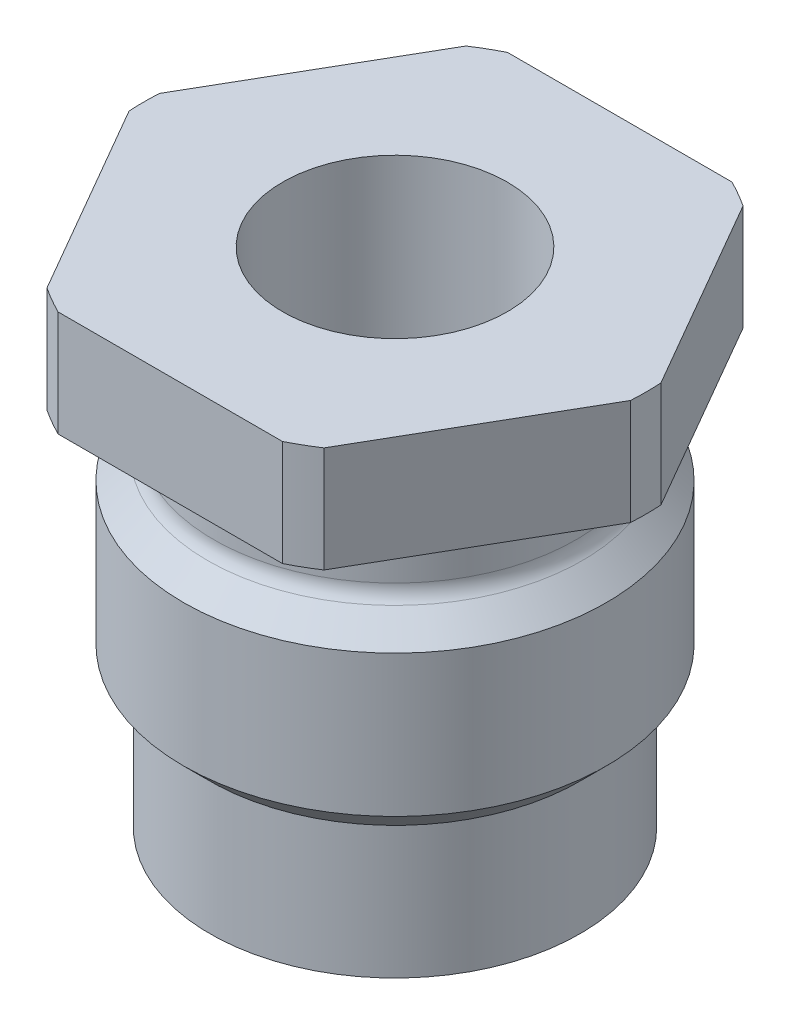
ISO-10303-21;
HEADER;
FILE_DESCRIPTION(('STEP AP214'),'2;1');
FILE_NAME('part.step','',(''),(''),'','','');
FILE_SCHEMA(('AUTOMOTIVE_DESIGN { 1 0 10303 214 1 1 1 1 }'));
ENDSEC;
DATA;
#1=APPLICATION_CONTEXT('core data for automotive mechanical design processes');
#2=APPLICATION_PROTOCOL_DEFINITION('international standard','automotive_design',2000,#1);
#3=PRODUCT_CONTEXT('',#1,'mechanical');
#4=PRODUCT('Part','Part','',(#3));
#5=PRODUCT_RELATED_PRODUCT_CATEGORY('part','',(#4));
#6=PRODUCT_DEFINITION_FORMATION('','',#4);
#7=PRODUCT_DEFINITION_CONTEXT('part definition',#1,'design');
#8=PRODUCT_DEFINITION('design','',#6,#7);
#9=PRODUCT_DEFINITION_SHAPE('','',#8);
#10=(LENGTH_UNIT() NAMED_UNIT(*) SI_UNIT(.MILLI.,.METRE.));
#11=(NAMED_UNIT(*) PLANE_ANGLE_UNIT() SI_UNIT($,.RADIAN.));
#12=(NAMED_UNIT(*) SI_UNIT($,.STERADIAN.) SOLID_ANGLE_UNIT());
#13=UNCERTAINTY_MEASURE_WITH_UNIT(LENGTH_MEASURE(1.E-05),#10,'distance_accuracy_value','');
#14=(GEOMETRIC_REPRESENTATION_CONTEXT(3) GLOBAL_UNCERTAINTY_ASSIGNED_CONTEXT((#13)) GLOBAL_UNIT_ASSIGNED_CONTEXT((#10,
#11,#12)) REPRESENTATION_CONTEXT('',''));
#15=CARTESIAN_POINT('',(0.,0.,0.));
#16=DIRECTION('',(0.,0.,1.));
#17=DIRECTION('',(1.,0.,0.));
#18=AXIS2_PLACEMENT_3D('',#15,#16,#17);
#19=CARTESIAN_POINT('',(-9.5,19.,0.));
#20=DIRECTION('',(0.,-1.,0.));
#21=DIRECTION('',(0.,0.,-1.));
#22=AXIS2_PLACEMENT_3D('',#19,#20,#21);
#23=PLANE('',#22);
#24=CARTESIAN_POINT('',(0.,19.,0.));
#25=DIRECTION('',(0.,-1.,0.));
#26=DIRECTION('',(0.,0.,-1.));
#27=AXIS2_PLACEMENT_3D('',#24,#25,#26);
#28=CIRCLE('',#27,4.25);
#29=CARTESIAN_POINT('',(0.,19.,-4.25));
#30=VERTEX_POINT('',#29);
#31=EDGE_CURVE('E153',#30,#30,#28,.T.);
#32=ORIENTED_EDGE('',*,*,#31,.T.);
#33=EDGE_LOOP('',(#32));
#34=FACE_BOUND('',#33,.T.);
#35=DIRECTION('',(0.5,0.,-0.866025403784439));
#36=VECTOR('',#35,1.);
#37=CARTESIAN_POINT('',(4.90747728811182,19.,8.5));
#38=LINE('',#37,#36);
#39=CARTESIAN_POINT('',(5.23989558860809,19.,7.92423461417476));
#40=VERTEX_POINT('',#39);
#41=CARTESIAN_POINT('',(9.48253627572737,19.,0.575765385825237));
#42=VERTEX_POINT('',#41);
#43=EDGE_CURVE('E136',#40,#42,#38,.T.);
#44=ORIENTED_EDGE('',*,*,#43,.T.);
#45=CARTESIAN_POINT('',(0.,19.,0.));
#46=DIRECTION('',(0.,-1.,0.));
#47=DIRECTION('',(0.,0.,-1.));
#48=AXIS2_PLACEMENT_3D('',#45,#46,#47);
#49=CIRCLE('',#48,9.5);
#50=CARTESIAN_POINT('',(9.48253627572737,19.,-0.575765385825233));
#51=VERTEX_POINT('',#50);
#52=EDGE_CURVE('E143',#51,#42,#49,.T.);
#53=ORIENTED_EDGE('',*,*,#52,.F.);
#54=DIRECTION('',(-0.5,0.,-0.866025403784438));
#55=VECTOR('',#54,1.);
#56=CARTESIAN_POINT('',(9.81495457622364,19.,0.));
#57=LINE('',#56,#55);
#58=CARTESIAN_POINT('',(5.23989558860808,19.,-7.92423461417477));
#59=VERTEX_POINT('',#58);
#60=EDGE_CURVE('E124',#51,#59,#57,.T.);
#61=ORIENTED_EDGE('',*,*,#60,.T.);
#62=CARTESIAN_POINT('',(4.24264068711928,19.,-8.5));
#63=VERTEX_POINT('',#62);
#64=EDGE_CURVE('E150',#63,#59,#49,.T.);
#65=ORIENTED_EDGE('',*,*,#64,.F.);
#66=DIRECTION('',(-1.,0.,0.));
#67=VECTOR('',#66,1.);
#68=CARTESIAN_POINT('',(4.90747728811181,19.,-8.5));
#69=LINE('',#68,#67);
#70=CARTESIAN_POINT('',(-4.24264068711928,19.,-8.5));
#71=VERTEX_POINT('',#70);
#72=EDGE_CURVE('E135',#63,#71,#69,.T.);
#73=ORIENTED_EDGE('',*,*,#72,.T.);
#74=CARTESIAN_POINT('',(-5.23989558860809,19.,-7.92423461417477));
#75=VERTEX_POINT('',#74);
#76=EDGE_CURVE('E154',#75,#71,#49,.T.);
#77=ORIENTED_EDGE('',*,*,#76,.F.);
#78=DIRECTION('',(-0.5,0.,0.866025403784439));
#79=VECTOR('',#78,1.);
#80=CARTESIAN_POINT('',(-4.90747728811182,19.,-8.5));
#81=LINE('',#80,#79);
#82=CARTESIAN_POINT('',(-9.48253627572737,19.,-0.575765385825234));
#83=VERTEX_POINT('',#82);
#84=EDGE_CURVE('E222',#75,#83,#81,.T.);
#85=ORIENTED_EDGE('',*,*,#84,.T.);
#86=CARTESIAN_POINT('',(-9.48253627572737,19.,0.575765385825239));
#87=VERTEX_POINT('',#86);
#88=EDGE_CURVE('E204',#87,#83,#49,.T.);
#89=ORIENTED_EDGE('',*,*,#88,.F.);
#90=DIRECTION('',(0.5,0.,0.866025403784438));
#91=VECTOR('',#90,1.);
#92=CARTESIAN_POINT('',(-9.81495457622364,19.,0.));
#93=LINE('',#92,#91);
#94=CARTESIAN_POINT('',(-5.23989558860809,19.,7.92423461417476));
#95=VERTEX_POINT('',#94);
#96=EDGE_CURVE('E220',#87,#95,#93,.T.);
#97=ORIENTED_EDGE('',*,*,#96,.T.);
#98=CARTESIAN_POINT('',(-4.24264068711929,19.,8.5));
#99=VERTEX_POINT('',#98);
#100=EDGE_CURVE('E156',#99,#95,#49,.T.);
#101=ORIENTED_EDGE('',*,*,#100,.F.);
#102=DIRECTION('',(1.,0.,0.));
#103=VECTOR('',#102,1.);
#104=CARTESIAN_POINT('',(-4.90747728811182,19.,8.5));
#105=LINE('',#104,#103);
#106=CARTESIAN_POINT('',(4.24264068711929,19.,8.5));
#107=VERTEX_POINT('',#106);
#108=EDGE_CURVE('E219',#99,#107,#105,.T.);
#109=ORIENTED_EDGE('',*,*,#108,.T.);
#110=EDGE_CURVE('E151',#40,#107,#49,.T.);
#111=ORIENTED_EDGE('',*,*,#110,.F.);
#112=EDGE_LOOP('',(#44,#53,#61,#65,#73,#77,#85,#89,#97,#101,#109,#111));
#113=FACE_BOUND('',#112,.T.);
#114=ADVANCED_FACE('F37',(#34,#113),#23,.F.);
#115=CARTESIAN_POINT('',(0.,0.,0.));
#116=DIRECTION('',(0.,-1.,0.));
#117=DIRECTION('',(0.,0.,-1.));
#118=AXIS2_PLACEMENT_3D('',#115,#116,#117);
#119=CYLINDRICAL_SURFACE('',#118,9.5);
#120=DIRECTION('',(0.,-1.,0.));
#121=VECTOR('',#120,1.);
#122=CARTESIAN_POINT('',(5.23989558860809,0.,7.92423461417476));
#123=LINE('',#122,#121);
#124=CARTESIAN_POINT('',(5.23989558860809,15.,7.92423461417477));
#125=VERTEX_POINT('',#124);
#126=EDGE_CURVE('E240',#40,#125,#123,.T.);
#127=ORIENTED_EDGE('',*,*,#126,.F.);
#128=ORIENTED_EDGE('',*,*,#110,.T.);
#129=DIRECTION('',(0.,-1.,0.));
#130=VECTOR('',#129,1.);
#131=CARTESIAN_POINT('',(4.24264068711929,0.,8.5));
#132=LINE('',#131,#130);
#133=CARTESIAN_POINT('',(4.24264068711928,15.,8.5));
#134=VERTEX_POINT('',#133);
#135=EDGE_CURVE('E174',#134,#107,#132,.F.);
#136=ORIENTED_EDGE('',*,*,#135,.F.);
#137=CARTESIAN_POINT('',(0.,15.,0.));
#138=DIRECTION('',(0.,-1.,0.));
#139=DIRECTION('',(0.,0.,-1.));
#140=AXIS2_PLACEMENT_3D('',#137,#138,#139);
#141=CIRCLE('',#140,9.5);
#142=EDGE_CURVE('E186',#125,#134,#141,.T.);
#143=ORIENTED_EDGE('',*,*,#142,.F.);
#144=EDGE_LOOP('',(#127,#128,#136,#143));
#145=FACE_BOUND('',#144,.T.);
#146=ADVANCED_FACE('F185',(#145),#119,.T.);
#147=DIRECTION('',(0.,-1.,0.));
#148=VECTOR('',#147,1.);
#149=CARTESIAN_POINT('',(9.48253627572737,0.,0.575765385825237));
#150=LINE('',#149,#148);
#151=CARTESIAN_POINT('',(9.48253627572737,15.,0.575765385825233));
#152=VERTEX_POINT('',#151);
#153=EDGE_CURVE('E238',#152,#42,#150,.F.);
#154=ORIENTED_EDGE('',*,*,#153,.F.);
#155=CARTESIAN_POINT('',(9.48253627572737,15.,-0.575765385825238));
#156=VERTEX_POINT('',#155);
#157=EDGE_CURVE('E145',#156,#152,#141,.T.);
#158=ORIENTED_EDGE('',*,*,#157,.F.);
#159=DIRECTION('',(0.,-1.,0.));
#160=VECTOR('',#159,1.);
#161=CARTESIAN_POINT('',(9.48253627572737,0.,-0.575765385825234));
#162=LINE('',#161,#160);
#163=EDGE_CURVE('E127',#51,#156,#162,.T.);
#164=ORIENTED_EDGE('',*,*,#163,.F.);
#165=ORIENTED_EDGE('',*,*,#52,.T.);
#166=EDGE_LOOP('',(#154,#158,#164,#165));
#167=FACE_BOUND('',#166,.T.);
#168=ADVANCED_FACE('F142',(#167),#119,.T.);
#169=DIRECTION('',(0.,-1.,0.));
#170=VECTOR('',#169,1.);
#171=CARTESIAN_POINT('',(-4.24264068711929,0.,8.5));
#172=LINE('',#171,#170);
#173=CARTESIAN_POINT('',(-4.24264068711929,15.,8.5));
#174=VERTEX_POINT('',#173);
#175=EDGE_CURVE('E177',#99,#174,#172,.T.);
#176=ORIENTED_EDGE('',*,*,#175,.F.);
#177=ORIENTED_EDGE('',*,*,#100,.T.);
#178=DIRECTION('',(0.,-1.,0.));
#179=VECTOR('',#178,1.);
#180=CARTESIAN_POINT('',(-5.23989558860809,0.,7.92423461417477));
#181=LINE('',#180,#179);
#182=CARTESIAN_POINT('',(-5.23989558860809,15.,7.92423461417477));
#183=VERTEX_POINT('',#182);
#184=EDGE_CURVE('E217',#183,#95,#181,.F.);
#185=ORIENTED_EDGE('',*,*,#184,.F.);
#186=EDGE_CURVE('E190',#174,#183,#141,.T.);
#187=ORIENTED_EDGE('',*,*,#186,.F.);
#188=EDGE_LOOP('',(#176,#177,#185,#187));
#189=FACE_BOUND('',#188,.T.);
#190=ADVANCED_FACE('F216',(#189),#119,.T.);
#191=DIRECTION('',(0.,-1.,0.));
#192=VECTOR('',#191,1.);
#193=CARTESIAN_POINT('',(-9.48253627572737,0.,0.57576538582524));
#194=LINE('',#193,#192);
#195=CARTESIAN_POINT('',(-9.48253627572737,15.,0.57576538582524));
#196=VERTEX_POINT('',#195);
#197=EDGE_CURVE('E60',#87,#196,#194,.T.);
#198=ORIENTED_EDGE('',*,*,#197,.F.);
#199=ORIENTED_EDGE('',*,*,#88,.T.);
#200=DIRECTION('',(0.,-1.,0.));
#201=VECTOR('',#200,1.);
#202=CARTESIAN_POINT('',(-9.48253627572737,0.,-0.575765385825233));
#203=LINE('',#202,#201);
#204=CARTESIAN_POINT('',(-9.48253627572737,15.,-0.575765385825233));
#205=VERTEX_POINT('',#204);
#206=EDGE_CURVE('E232',#205,#83,#203,.F.);
#207=ORIENTED_EDGE('',*,*,#206,.F.);
#208=EDGE_CURVE('E191',#196,#205,#141,.T.);
#209=ORIENTED_EDGE('',*,*,#208,.F.);
#210=EDGE_LOOP('',(#198,#199,#207,#209));
#211=FACE_BOUND('',#210,.T.);
#212=ADVANCED_FACE('F407',(#211),#119,.T.);
#213=DIRECTION('',(0.,-1.,0.));
#214=VECTOR('',#213,1.);
#215=CARTESIAN_POINT('',(-5.23989558860809,0.,-7.92423461417477));
#216=LINE('',#215,#214);
#217=CARTESIAN_POINT('',(-5.23989558860809,15.,-7.92423461417477));
#218=VERTEX_POINT('',#217);
#219=EDGE_CURVE('E52',#75,#218,#216,.T.);
#220=ORIENTED_EDGE('',*,*,#219,.F.);
#221=ORIENTED_EDGE('',*,*,#76,.T.);
#222=DIRECTION('',(0.,-1.,0.));
#223=VECTOR('',#222,1.);
#224=CARTESIAN_POINT('',(-4.24264068711928,0.,-8.5));
#225=LINE('',#224,#223);
#226=CARTESIAN_POINT('',(-4.24264068711928,15.,-8.5));
#227=VERTEX_POINT('',#226);
#228=EDGE_CURVE('E146',#227,#71,#225,.F.);
#229=ORIENTED_EDGE('',*,*,#228,.F.);
#230=EDGE_CURVE('E193',#218,#227,#141,.T.);
#231=ORIENTED_EDGE('',*,*,#230,.F.);
#232=EDGE_LOOP('',(#220,#221,#229,#231));
#233=FACE_BOUND('',#232,.T.);
#234=ADVANCED_FACE('F282',(#233),#119,.T.);
#235=DIRECTION('',(0.,-1.,0.));
#236=VECTOR('',#235,1.);
#237=CARTESIAN_POINT('',(4.24264068711928,0.,-8.5));
#238=LINE('',#237,#236);
#239=CARTESIAN_POINT('',(4.24264068711928,15.,-8.5));
#240=VERTEX_POINT('',#239);
#241=EDGE_CURVE('E230',#63,#240,#238,.T.);
#242=ORIENTED_EDGE('',*,*,#241,.F.);
#243=ORIENTED_EDGE('',*,*,#64,.T.);
#244=DIRECTION('',(0.,-1.,0.));
#245=VECTOR('',#244,1.);
#246=CARTESIAN_POINT('',(5.23989558860808,0.,-7.92423461417477));
#247=LINE('',#246,#245);
#248=CARTESIAN_POINT('',(5.23989558860808,15.,-7.92423461417477));
#249=VERTEX_POINT('',#248);
#250=EDGE_CURVE('E130',#249,#59,#247,.F.);
#251=ORIENTED_EDGE('',*,*,#250,.F.);
#252=EDGE_CURVE('E159',#240,#249,#141,.T.);
#253=ORIENTED_EDGE('',*,*,#252,.F.);
#254=EDGE_LOOP('',(#242,#243,#251,#253));
#255=FACE_BOUND('',#254,.T.);
#256=ADVANCED_FACE('F275',(#255),#119,.T.);
#257=CARTESIAN_POINT('',(-7.65000000000001,15.,0.));
#258=DIRECTION('',(0.,1.,0.));
#259=DIRECTION('',(0.,0.,1.));
#260=AXIS2_PLACEMENT_3D('',#257,#258,#259);
#261=PLANE('',#260);
#262=CARTESIAN_POINT('',(0.,15.,0.));
#263=DIRECTION('',(0.,-1.,0.));
#264=DIRECTION('',(0.,0.,-1.));
#265=AXIS2_PLACEMENT_3D('',#262,#263,#264);
#266=CIRCLE('',#265,7.65000000000001);
#267=CARTESIAN_POINT('',(0.,15.,-7.65000000000001));
#268=VERTEX_POINT('',#267);
#269=EDGE_CURVE('E196',#268,#268,#266,.T.);
#270=ORIENTED_EDGE('',*,*,#269,.F.);
#271=EDGE_LOOP('',(#270));
#272=FACE_BOUND('',#271,.T.);
#273=DIRECTION('',(0.5,0.,-0.866025403784439));
#274=VECTOR('',#273,1.);
#275=CARTESIAN_POINT('',(5.44871593216773,15.,7.56254716947548));
#276=LINE('',#275,#274);
#277=EDGE_CURVE('E12',#125,#152,#276,.T.);
#278=ORIENTED_EDGE('',*,*,#277,.F.);
#279=ORIENTED_EDGE('',*,*,#142,.T.);
#280=DIRECTION('',(1.,0.,0.));
#281=VECTOR('',#280,1.);
#282=CARTESIAN_POINT('',(-7.65000000000001,15.,8.5));
#283=LINE('',#282,#281);
#284=EDGE_CURVE('E45',#174,#134,#283,.T.);
#285=ORIENTED_EDGE('',*,*,#284,.F.);
#286=ORIENTED_EDGE('',*,*,#186,.T.);
#287=DIRECTION('',(0.5,0.,0.866025403784439));
#288=VECTOR('',#287,1.);
#289=CARTESIAN_POINT('',(-9.27371593216773,15.,0.937452830524521));
#290=LINE('',#289,#288);
#291=EDGE_CURVE('E169',#196,#183,#290,.T.);
#292=ORIENTED_EDGE('',*,*,#291,.F.);
#293=ORIENTED_EDGE('',*,*,#208,.T.);
#294=DIRECTION('',(-0.5,0.,0.866025403784439));
#295=VECTOR('',#294,1.);
#296=CARTESIAN_POINT('',(-9.27371593216773,15.,-0.937452830524519));
#297=LINE('',#296,#295);
#298=EDGE_CURVE('E167',#218,#205,#297,.T.);
#299=ORIENTED_EDGE('',*,*,#298,.F.);
#300=ORIENTED_EDGE('',*,*,#230,.T.);
#301=DIRECTION('',(-1.,0.,0.));
#302=VECTOR('',#301,1.);
#303=CARTESIAN_POINT('',(-7.65000000000001,15.,-8.5));
#304=LINE('',#303,#302);
#305=EDGE_CURVE('E165',#240,#227,#304,.T.);
#306=ORIENTED_EDGE('',*,*,#305,.F.);
#307=ORIENTED_EDGE('',*,*,#252,.T.);
#308=DIRECTION('',(-0.5,0.,-0.866025403784438));
#309=VECTOR('',#308,1.);
#310=CARTESIAN_POINT('',(5.44871593216772,15.,-7.56254716947549));
#311=LINE('',#310,#309);
#312=EDGE_CURVE('E163',#156,#249,#311,.T.);
#313=ORIENTED_EDGE('',*,*,#312,.F.);
#314=ORIENTED_EDGE('',*,*,#157,.T.);
#315=EDGE_LOOP('',(#278,#279,#285,#286,#292,#293,#299,#300,#306,#307,#313,#314));
#316=FACE_BOUND('',#315,.T.);
#317=ADVANCED_FACE('F189',(#272,#316),#261,.F.);
#318=CARTESIAN_POINT('',(0.,0.,0.));
#319=DIRECTION('',(0.,-1.,0.));
#320=DIRECTION('',(0.,0.,-1.));
#321=AXIS2_PLACEMENT_3D('',#318,#319,#320);
#322=CYLINDRICAL_SURFACE('',#321,4.25);
#323=ORIENTED_EDGE('',*,*,#31,.F.);
#324=EDGE_LOOP('',(#323));
#325=FACE_BOUND('',#324,.T.);
#326=CARTESIAN_POINT('',(0.,0.,0.));
#327=DIRECTION('',(0.,-1.,0.));
#328=DIRECTION('',(0.,0.,-1.));
#329=AXIS2_PLACEMENT_3D('',#326,#327,#328);
#330=CIRCLE('',#329,4.24999999999999);
#331=CARTESIAN_POINT('',(0.,0.,-4.24999999999999));
#332=VERTEX_POINT('',#331);
#333=EDGE_CURVE('E242',#332,#332,#330,.T.);
#334=ORIENTED_EDGE('',*,*,#333,.T.);
#335=EDGE_LOOP('',(#334));
#336=FACE_BOUND('',#335,.T.);
#337=ADVANCED_FACE('F39',(#325,#336),#322,.F.);
#338=CARTESIAN_POINT('',(0.,14.2,0.));
#339=DIRECTION('',(0.,-1.,0.));
#340=DIRECTION('',(0.,0.,-1.));
#341=AXIS2_PLACEMENT_3D('',#338,#339,#340);
#342=TOROIDAL_SURFACE('',#341,7.65,0.799999999999999);
#343=CARTESIAN_POINT('',(0.,14.2,0.));
#344=DIRECTION('',(0.,-1.,0.));
#345=DIRECTION('',(0.,0.,-1.));
#346=AXIS2_PLACEMENT_3D('',#343,#344,#345);
#347=CIRCLE('',#346,6.85);
#348=CARTESIAN_POINT('',(0.,14.2,-6.85));
#349=VERTEX_POINT('',#348);
#350=EDGE_CURVE('E200',#349,#349,#347,.T.);
#351=ORIENTED_EDGE('',*,*,#350,.F.);
#352=EDGE_LOOP('',(#351));
#353=FACE_BOUND('',#352,.T.);
#354=ORIENTED_EDGE('',*,*,#269,.T.);
#355=EDGE_LOOP('',(#354));
#356=FACE_BOUND('',#355,.T.);
#357=ADVANCED_FACE('F268',(#353,#356),#342,.F.);
#358=CARTESIAN_POINT('',(0.,0.,0.));
#359=DIRECTION('',(0.,-1.,0.));
#360=DIRECTION('',(0.,0.,-1.));
#361=AXIS2_PLACEMENT_3D('',#358,#359,#360);
#362=CYLINDRICAL_SURFACE('',#361,6.85);
#363=CARTESIAN_POINT('',(0.,12.8313708498985,0.));
#364=DIRECTION('',(0.,-1.,0.));
#365=DIRECTION('',(0.,0.,-1.));
#366=AXIS2_PLACEMENT_3D('',#363,#364,#365);
#367=CIRCLE('',#366,6.85);
#368=CARTESIAN_POINT('',(0.,12.8313708498985,-6.85));
#369=VERTEX_POINT('',#368);
#370=EDGE_CURVE('E260',#369,#369,#367,.T.);
#371=ORIENTED_EDGE('',*,*,#370,.F.);
#372=EDGE_LOOP('',(#371));
#373=FACE_BOUND('',#372,.T.);
#374=ORIENTED_EDGE('',*,*,#350,.T.);
#375=EDGE_LOOP('',(#374));
#376=FACE_BOUND('',#375,.T.);
#377=ADVANCED_FACE('F266',(#373,#376),#362,.T.);
#378=CARTESIAN_POINT('',(0.,12.8313708498985,0.));
#379=DIRECTION('',(0.,-1.,0.));
#380=DIRECTION('',(0.,0.,-1.));
#381=AXIS2_PLACEMENT_3D('',#378,#379,#380);
#382=TOROIDAL_SURFACE('',#381,7.65,0.799999999999999);
#383=CARTESIAN_POINT('',(0.,12.2656854249492,0.));
#384=DIRECTION('',(0.,-1.,0.));
#385=DIRECTION('',(0.,0.,-1.));
#386=AXIS2_PLACEMENT_3D('',#383,#384,#385);
#387=CIRCLE('',#386,7.08431457505076);
#388=CARTESIAN_POINT('',(0.,12.2656854249492,-7.08431457505076));
#389=VERTEX_POINT('',#388);
#390=EDGE_CURVE('E257',#389,#389,#387,.T.);
#391=ORIENTED_EDGE('',*,*,#390,.F.);
#392=EDGE_LOOP('',(#391));
#393=FACE_BOUND('',#392,.T.);
#394=ORIENTED_EDGE('',*,*,#370,.T.);
#395=EDGE_LOOP('',(#394));
#396=FACE_BOUND('',#395,.T.);
#397=ADVANCED_FACE('F321',(#393,#396),#382,.F.);
#398=CARTESIAN_POINT('',(0.,12.2656854249492,0.));
#399=DIRECTION('',(0.,-1.,0.));
#400=DIRECTION('',(0.,0.,-1.));
#401=AXIS2_PLACEMENT_3D('',#398,#399,#400);
#402=CONICAL_SURFACE('',#401,7.08431457505076,0.785398163397446);
#403=CARTESIAN_POINT('',(0.,11.35,0.));
#404=DIRECTION('',(0.,-1.,0.));
#405=DIRECTION('',(0.,0.,-1.));
#406=AXIS2_PLACEMENT_3D('',#403,#404,#405);
#407=CIRCLE('',#406,8.);
#408=CARTESIAN_POINT('',(0.,11.35,-8.));
#409=VERTEX_POINT('',#408);
#410=EDGE_CURVE('E254',#409,#409,#407,.T.);
#411=ORIENTED_EDGE('',*,*,#410,.F.);
#412=EDGE_LOOP('',(#411));
#413=FACE_BOUND('',#412,.T.);
#414=ORIENTED_EDGE('',*,*,#390,.T.);
#415=EDGE_LOOP('',(#414));
#416=FACE_BOUND('',#415,.T.);
#417=ADVANCED_FACE('F315',(#413,#416),#402,.T.);
#418=CARTESIAN_POINT('',(0.,0.,0.));
#419=DIRECTION('',(0.,-1.,0.));
#420=DIRECTION('',(0.,0.,-1.));
#421=AXIS2_PLACEMENT_3D('',#418,#419,#420);
#422=CYLINDRICAL_SURFACE('',#421,8.);
#423=CARTESIAN_POINT('',(0.,6.,0.));
#424=DIRECTION('',(0.,-1.,0.));
#425=DIRECTION('',(0.,0.,-1.));
#426=AXIS2_PLACEMENT_3D('',#423,#424,#425);
#427=CIRCLE('',#426,8.);
#428=CARTESIAN_POINT('',(0.,6.,-8.));
#429=VERTEX_POINT('',#428);
#430=EDGE_CURVE('E251',#429,#429,#427,.T.);
#431=ORIENTED_EDGE('',*,*,#430,.F.);
#432=EDGE_LOOP('',(#431));
#433=FACE_BOUND('',#432,.T.);
#434=ORIENTED_EDGE('',*,*,#410,.T.);
#435=EDGE_LOOP('',(#434));
#436=FACE_BOUND('',#435,.T.);
#437=ADVANCED_FACE('F309',(#433,#436),#422,.T.);
#438=CARTESIAN_POINT('',(0.,6.,0.));
#439=DIRECTION('',(0.,1.,0.));
#440=DIRECTION('',(0.,0.,1.));
#441=AXIS2_PLACEMENT_3D('',#438,#439,#440);
#442=CONICAL_SURFACE('',#441,8.,0.78539816339745);
#443=CARTESIAN_POINT('',(0.,5.,0.));
#444=DIRECTION('',(0.,-1.,0.));
#445=DIRECTION('',(0.,0.,-1.));
#446=AXIS2_PLACEMENT_3D('',#443,#444,#445);
#447=CIRCLE('',#446,7.);
#448=CARTESIAN_POINT('',(0.,5.,-7.));
#449=VERTEX_POINT('',#448);
#450=EDGE_CURVE('E248',#449,#449,#447,.T.);
#451=ORIENTED_EDGE('',*,*,#450,.F.);
#452=EDGE_LOOP('',(#451));
#453=FACE_BOUND('',#452,.T.);
#454=ORIENTED_EDGE('',*,*,#430,.T.);
#455=EDGE_LOOP('',(#454));
#456=FACE_BOUND('',#455,.T.);
#457=ADVANCED_FACE('F303',(#453,#456),#442,.T.);
#458=CARTESIAN_POINT('',(0.,0.,0.));
#459=DIRECTION('',(0.,-1.,0.));
#460=DIRECTION('',(0.,0.,-1.));
#461=AXIS2_PLACEMENT_3D('',#458,#459,#460);
#462=CYLINDRICAL_SURFACE('',#461,7.);
#463=CARTESIAN_POINT('',(0.,0.,0.));
#464=DIRECTION('',(0.,-1.,0.));
#465=DIRECTION('',(0.,0.,-1.));
#466=AXIS2_PLACEMENT_3D('',#463,#464,#465);
#467=CIRCLE('',#466,7.);
#468=CARTESIAN_POINT('',(0.,0.,-7.));
#469=VERTEX_POINT('',#468);
#470=EDGE_CURVE('E245',#469,#469,#467,.T.);
#471=ORIENTED_EDGE('',*,*,#470,.F.);
#472=EDGE_LOOP('',(#471));
#473=FACE_BOUND('',#472,.T.);
#474=ORIENTED_EDGE('',*,*,#450,.T.);
#475=EDGE_LOOP('',(#474));
#476=FACE_BOUND('',#475,.T.);
#477=ADVANCED_FACE('F297',(#473,#476),#462,.T.);
#478=CARTESIAN_POINT('',(-4.24999999999999,0.,0.));
#479=DIRECTION('',(0.,1.,0.));
#480=DIRECTION('',(0.,0.,1.));
#481=AXIS2_PLACEMENT_3D('',#478,#479,#480);
#482=PLANE('',#481);
#483=ORIENTED_EDGE('',*,*,#333,.F.);
#484=EDGE_LOOP('',(#483));
#485=FACE_BOUND('',#484,.T.);
#486=ORIENTED_EDGE('',*,*,#470,.T.);
#487=EDGE_LOOP('',(#486));
#488=FACE_BOUND('',#487,.T.);
#489=ADVANCED_FACE('F294',(#485,#488),#482,.F.);
#490=CARTESIAN_POINT('',(9.81495457622364,0.,0.));
#491=DIRECTION('',(0.866025403784438,0.,-0.5));
#492=DIRECTION('',(-0.5,0.,-0.866025403784438));
#493=AXIS2_PLACEMENT_3D('',#490,#491,#492);
#494=PLANE('',#493);
#495=ORIENTED_EDGE('',*,*,#163,.T.);
#496=ORIENTED_EDGE('',*,*,#312,.T.);
#497=ORIENTED_EDGE('',*,*,#250,.T.);
#498=ORIENTED_EDGE('',*,*,#60,.F.);
#499=EDGE_LOOP('',(#495,#496,#497,#498));
#500=FACE_BOUND('',#499,.T.);
#501=ADVANCED_FACE('F126',(#500),#494,.T.);
#502=CARTESIAN_POINT('',(4.90747728811181,0.,-8.5));
#503=DIRECTION('',(0.,0.,-1.));
#504=DIRECTION('',(-1.,0.,0.));
#505=AXIS2_PLACEMENT_3D('',#502,#503,#504);
#506=PLANE('',#505);
#507=ORIENTED_EDGE('',*,*,#241,.T.);
#508=ORIENTED_EDGE('',*,*,#305,.T.);
#509=ORIENTED_EDGE('',*,*,#228,.T.);
#510=ORIENTED_EDGE('',*,*,#72,.F.);
#511=EDGE_LOOP('',(#507,#508,#509,#510));
#512=FACE_BOUND('',#511,.T.);
#513=ADVANCED_FACE('F341',(#512),#506,.T.);
#514=CARTESIAN_POINT('',(-4.90747728811182,0.,-8.5));
#515=DIRECTION('',(-0.866025403784439,0.,-0.5));
#516=DIRECTION('',(-0.5,0.,0.866025403784439));
#517=AXIS2_PLACEMENT_3D('',#514,#515,#516);
#518=PLANE('',#517);
#519=ORIENTED_EDGE('',*,*,#219,.T.);
#520=ORIENTED_EDGE('',*,*,#298,.T.);
#521=ORIENTED_EDGE('',*,*,#206,.T.);
#522=ORIENTED_EDGE('',*,*,#84,.F.);
#523=EDGE_LOOP('',(#519,#520,#521,#522));
#524=FACE_BOUND('',#523,.T.);
#525=ADVANCED_FACE('F344',(#524),#518,.T.);
#526=CARTESIAN_POINT('',(-9.81495457622364,0.,0.));
#527=DIRECTION('',(-0.866025403784439,0.,0.5));
#528=DIRECTION('',(0.5,0.,0.866025403784439));
#529=AXIS2_PLACEMENT_3D('',#526,#527,#528);
#530=PLANE('',#529);
#531=ORIENTED_EDGE('',*,*,#197,.T.);
#532=ORIENTED_EDGE('',*,*,#291,.T.);
#533=ORIENTED_EDGE('',*,*,#184,.T.);
#534=ORIENTED_EDGE('',*,*,#96,.F.);
#535=EDGE_LOOP('',(#531,#532,#533,#534));
#536=FACE_BOUND('',#535,.T.);
#537=ADVANCED_FACE('F348',(#536),#530,.T.);
#538=CARTESIAN_POINT('',(-4.90747728811182,0.,8.5));
#539=DIRECTION('',(0.,0.,1.));
#540=DIRECTION('',(1.,0.,0.));
#541=AXIS2_PLACEMENT_3D('',#538,#539,#540);
#542=PLANE('',#541);
#543=ORIENTED_EDGE('',*,*,#175,.T.);
#544=ORIENTED_EDGE('',*,*,#284,.T.);
#545=ORIENTED_EDGE('',*,*,#135,.T.);
#546=ORIENTED_EDGE('',*,*,#108,.F.);
#547=EDGE_LOOP('',(#543,#544,#545,#546));
#548=FACE_BOUND('',#547,.T.);
#549=ADVANCED_FACE('F173',(#548),#542,.T.);
#550=CARTESIAN_POINT('',(4.90747728811182,0.,8.5));
#551=DIRECTION('',(0.866025403784439,0.,0.5));
#552=DIRECTION('',(0.5,0.,-0.866025403784439));
#553=AXIS2_PLACEMENT_3D('',#550,#551,#552);
#554=PLANE('',#553);
#555=ORIENTED_EDGE('',*,*,#126,.T.);
#556=ORIENTED_EDGE('',*,*,#277,.T.);
#557=ORIENTED_EDGE('',*,*,#153,.T.);
#558=ORIENTED_EDGE('',*,*,#43,.F.);
#559=EDGE_LOOP('',(#555,#556,#557,#558));
#560=FACE_BOUND('',#559,.T.);
#561=ADVANCED_FACE('F335',(#560),#554,.T.);
#562=CLOSED_SHELL('',(#114,#146,#168,#190,#212,#234,#256,#317,#337,#357,#377,#397,#417,#437,
#457,#477,#489,#501,#513,#525,#537,#549,#561));
#563=MANIFOLD_SOLID_BREP('B2',#562);
#564=ADVANCED_BREP_SHAPE_REPRESENTATION('',(#18,#563),#14);
#565=SHAPE_DEFINITION_REPRESENTATION(#9,#564);
ENDSEC;
END-ISO-10303-21;
